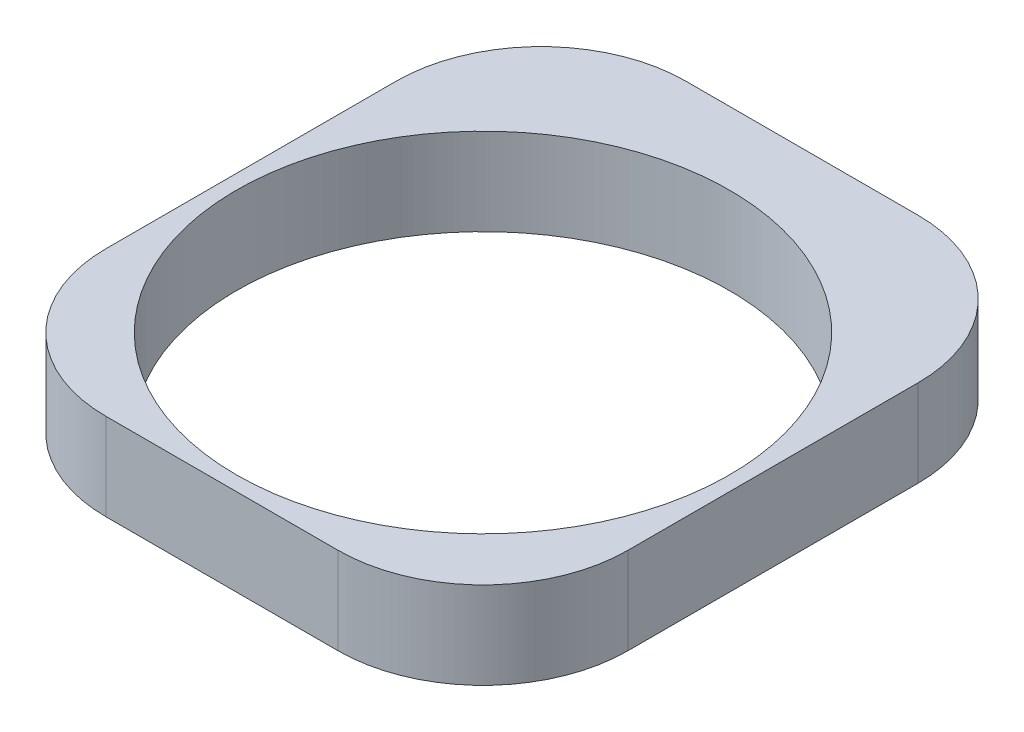
ISO-10303-21;
HEADER;
FILE_DESCRIPTION(('STEP AP214'),'2;1');
FILE_NAME('part.step','',(''),(''),'','','');
FILE_SCHEMA(('AUTOMOTIVE_DESIGN { 1 0 10303 214 1 1 1 1 }'));
ENDSEC;
DATA;
#1=APPLICATION_CONTEXT('core data for automotive mechanical design processes');
#2=APPLICATION_PROTOCOL_DEFINITION('international standard','automotive_design',2000,#1);
#3=PRODUCT_CONTEXT('',#1,'mechanical');
#4=PRODUCT('Part','Part','',(#3));
#5=PRODUCT_RELATED_PRODUCT_CATEGORY('part','',(#4));
#6=PRODUCT_DEFINITION_FORMATION('','',#4);
#7=PRODUCT_DEFINITION_CONTEXT('part definition',#1,'design');
#8=PRODUCT_DEFINITION('design','',#6,#7);
#9=PRODUCT_DEFINITION_SHAPE('','',#8);
#10=(LENGTH_UNIT() NAMED_UNIT(*) SI_UNIT(.MILLI.,.METRE.));
#11=(NAMED_UNIT(*) PLANE_ANGLE_UNIT() SI_UNIT($,.RADIAN.));
#12=(NAMED_UNIT(*) SI_UNIT($,.STERADIAN.) SOLID_ANGLE_UNIT());
#13=UNCERTAINTY_MEASURE_WITH_UNIT(LENGTH_MEASURE(1.E-05),#10,'distance_accuracy_value','');
#14=(GEOMETRIC_REPRESENTATION_CONTEXT(3) GLOBAL_UNCERTAINTY_ASSIGNED_CONTEXT((#13)) GLOBAL_UNIT_ASSIGNED_CONTEXT((#10,
#11,#12)) REPRESENTATION_CONTEXT('',''));
#15=CARTESIAN_POINT('',(0.,0.,0.));
#16=DIRECTION('',(0.,0.,1.));
#17=DIRECTION('',(1.,0.,0.));
#18=AXIS2_PLACEMENT_3D('',#15,#16,#17);
#19=CARTESIAN_POINT('',(0.,30.,0.));
#20=DIRECTION('',(-1.,0.,0.));
#21=DIRECTION('',(0.,0.,1.));
#22=AXIS2_PLACEMENT_3D('',#19,#20,#21);
#23=PLANE('',#22);
#24=DIRECTION('',(0.,0.,-1.));
#25=VECTOR('',#24,1.);
#26=CARTESIAN_POINT('',(0.,30.,0.));
#27=LINE('',#26,#25);
#28=CARTESIAN_POINT('',(0.,30.,-50.));
#29=VERTEX_POINT('',#28);
#30=CARTESIAN_POINT('',(0.,30.,-150.));
#31=VERTEX_POINT('',#30);
#32=EDGE_CURVE('E123',#29,#31,#27,.T.);
#33=ORIENTED_EDGE('',*,*,#32,.F.);
#34=DIRECTION('',(0.,-1.,0.));
#35=VECTOR('',#34,1.);
#36=CARTESIAN_POINT('',(0.,30.,-50.));
#37=LINE('',#36,#35);
#38=CARTESIAN_POINT('',(0.,0.,-50.));
#39=VERTEX_POINT('',#38);
#40=EDGE_CURVE('E130',#29,#39,#37,.T.);
#41=ORIENTED_EDGE('',*,*,#40,.T.);
#42=DIRECTION('',(0.,0.,-1.));
#43=VECTOR('',#42,1.);
#44=CARTESIAN_POINT('',(0.,0.,0.));
#45=LINE('',#44,#43);
#46=CARTESIAN_POINT('',(0.,0.,-150.));
#47=VERTEX_POINT('',#46);
#48=EDGE_CURVE('E114',#39,#47,#45,.T.);
#49=ORIENTED_EDGE('',*,*,#48,.T.);
#50=DIRECTION('',(0.,-1.,0.));
#51=VECTOR('',#50,1.);
#52=CARTESIAN_POINT('',(0.,30.,-150.));
#53=LINE('',#52,#51);
#54=EDGE_CURVE('E104',#47,#31,#53,.F.);
#55=ORIENTED_EDGE('',*,*,#54,.T.);
#56=EDGE_LOOP('',(#33,#41,#49,#55));
#57=FACE_BOUND('',#56,.T.);
#58=ADVANCED_FACE('F32',(#57),#23,.F.);
#59=CARTESIAN_POINT('',(0.,30.,-200.));
#60=DIRECTION('',(0.,0.,1.));
#61=DIRECTION('',(1.,0.,0.));
#62=AXIS2_PLACEMENT_3D('',#59,#60,#61);
#63=PLANE('',#62);
#64=DIRECTION('',(-1.,0.,0.));
#65=VECTOR('',#64,1.);
#66=CARTESIAN_POINT('',(0.,0.,-200.));
#67=LINE('',#66,#65);
#68=CARTESIAN_POINT('',(-50.,0.,-200.));
#69=VERTEX_POINT('',#68);
#70=CARTESIAN_POINT('',(-130.,0.,-200.));
#71=VERTEX_POINT('',#70);
#72=EDGE_CURVE('E108',#69,#71,#67,.T.);
#73=ORIENTED_EDGE('',*,*,#72,.T.);
#74=DIRECTION('',(0.,-1.,0.));
#75=VECTOR('',#74,1.);
#76=CARTESIAN_POINT('',(-130.,30.,-200.));
#77=LINE('',#76,#75);
#78=CARTESIAN_POINT('',(-130.,30.,-200.));
#79=VERTEX_POINT('',#78);
#80=EDGE_CURVE('E40',#71,#79,#77,.F.);
#81=ORIENTED_EDGE('',*,*,#80,.T.);
#82=DIRECTION('',(-1.,0.,0.));
#83=VECTOR('',#82,1.);
#84=CARTESIAN_POINT('',(0.,30.,-200.));
#85=LINE('',#84,#83);
#86=CARTESIAN_POINT('',(-50.,30.,-200.));
#87=VERTEX_POINT('',#86);
#88=EDGE_CURVE('E109',#87,#79,#85,.T.);
#89=ORIENTED_EDGE('',*,*,#88,.F.);
#90=DIRECTION('',(0.,-1.,0.));
#91=VECTOR('',#90,1.);
#92=CARTESIAN_POINT('',(-50.,30.,-200.));
#93=LINE('',#92,#91);
#94=EDGE_CURVE('E102',#87,#69,#93,.T.);
#95=ORIENTED_EDGE('',*,*,#94,.T.);
#96=EDGE_LOOP('',(#73,#81,#89,#95));
#97=FACE_BOUND('',#96,.T.);
#98=ADVANCED_FACE('F107',(#97),#63,.F.);
#99=CARTESIAN_POINT('',(-180.,30.,0.));
#100=DIRECTION('',(1.,0.,0.));
#101=DIRECTION('',(0.,0.,-1.));
#102=AXIS2_PLACEMENT_3D('',#99,#100,#101);
#103=PLANE('',#102);
#104=DIRECTION('',(0.,0.,1.));
#105=VECTOR('',#104,1.);
#106=CARTESIAN_POINT('',(-180.,30.,0.));
#107=LINE('',#106,#105);
#108=CARTESIAN_POINT('',(-180.,30.,-150.));
#109=VERTEX_POINT('',#108);
#110=CARTESIAN_POINT('',(-180.,30.,-50.));
#111=VERTEX_POINT('',#110);
#112=EDGE_CURVE('E159',#109,#111,#107,.T.);
#113=ORIENTED_EDGE('',*,*,#112,.F.);
#114=DIRECTION('',(0.,-1.,0.));
#115=VECTOR('',#114,1.);
#116=CARTESIAN_POINT('',(-180.,30.,-150.));
#117=LINE('',#116,#115);
#118=CARTESIAN_POINT('',(-180.,0.,-150.));
#119=VERTEX_POINT('',#118);
#120=EDGE_CURVE('E152',#109,#119,#117,.T.);
#121=ORIENTED_EDGE('',*,*,#120,.T.);
#122=DIRECTION('',(0.,0.,1.));
#123=VECTOR('',#122,1.);
#124=CARTESIAN_POINT('',(-180.,0.,0.));
#125=LINE('',#124,#123);
#126=CARTESIAN_POINT('',(-180.,0.,-50.));
#127=VERTEX_POINT('',#126);
#128=EDGE_CURVE('E113',#119,#127,#125,.T.);
#129=ORIENTED_EDGE('',*,*,#128,.T.);
#130=DIRECTION('',(0.,-1.,0.));
#131=VECTOR('',#130,1.);
#132=CARTESIAN_POINT('',(-180.,30.,-50.));
#133=LINE('',#132,#131);
#134=EDGE_CURVE('E147',#127,#111,#133,.F.);
#135=ORIENTED_EDGE('',*,*,#134,.T.);
#136=EDGE_LOOP('',(#113,#121,#129,#135));
#137=FACE_BOUND('',#136,.T.);
#138=ADVANCED_FACE('F158',(#137),#103,.F.);
#139=CARTESIAN_POINT('',(0.,30.,0.));
#140=DIRECTION('',(0.,0.,-1.));
#141=DIRECTION('',(-1.,0.,0.));
#142=AXIS2_PLACEMENT_3D('',#139,#140,#141);
#143=PLANE('',#142);
#144=DIRECTION('',(1.,0.,0.));
#145=VECTOR('',#144,1.);
#146=CARTESIAN_POINT('',(0.,30.,0.));
#147=LINE('',#146,#145);
#148=CARTESIAN_POINT('',(-130.,30.,0.));
#149=VERTEX_POINT('',#148);
#150=CARTESIAN_POINT('',(-50.,30.,0.));
#151=VERTEX_POINT('',#150);
#152=EDGE_CURVE('E110',#149,#151,#147,.T.);
#153=ORIENTED_EDGE('',*,*,#152,.F.);
#154=DIRECTION('',(0.,-1.,0.));
#155=VECTOR('',#154,1.);
#156=CARTESIAN_POINT('',(-130.,30.,0.));
#157=LINE('',#156,#155);
#158=CARTESIAN_POINT('',(-130.,0.,0.));
#159=VERTEX_POINT('',#158);
#160=EDGE_CURVE('E141',#149,#159,#157,.T.);
#161=ORIENTED_EDGE('',*,*,#160,.T.);
#162=DIRECTION('',(1.,0.,0.));
#163=VECTOR('',#162,1.);
#164=CARTESIAN_POINT('',(0.,0.,0.));
#165=LINE('',#164,#163);
#166=CARTESIAN_POINT('',(-50.,0.,0.));
#167=VERTEX_POINT('',#166);
#168=EDGE_CURVE('E116',#159,#167,#165,.T.);
#169=ORIENTED_EDGE('',*,*,#168,.T.);
#170=DIRECTION('',(0.,-1.,0.));
#171=VECTOR('',#170,1.);
#172=CARTESIAN_POINT('',(-50.,30.,0.));
#173=LINE('',#172,#171);
#174=EDGE_CURVE('E136',#167,#151,#173,.F.);
#175=ORIENTED_EDGE('',*,*,#174,.T.);
#176=EDGE_LOOP('',(#153,#161,#169,#175));
#177=FACE_BOUND('',#176,.T.);
#178=ADVANCED_FACE('F172',(#177),#143,.F.);
#179=CARTESIAN_POINT('',(0.,30.,0.));
#180=DIRECTION('',(0.,1.,0.));
#181=DIRECTION('',(0.,0.,1.));
#182=AXIS2_PLACEMENT_3D('',#179,#180,#181);
#183=PLANE('',#182);
#184=CARTESIAN_POINT('',(-90.,30.,-90.));
#185=DIRECTION('',(0.,1.,0.));
#186=DIRECTION('',(0.,0.,1.));
#187=AXIS2_PLACEMENT_3D('',#184,#185,#186);
#188=CIRCLE('',#187,85.);
#189=CARTESIAN_POINT('',(-90.,30.,-4.99999999999992));
#190=VERTEX_POINT('',#189);
#191=EDGE_CURVE('E125',#190,#190,#188,.T.);
#192=ORIENTED_EDGE('',*,*,#191,.F.);
#193=EDGE_LOOP('',(#192));
#194=FACE_BOUND('',#193,.T.);
#195=ORIENTED_EDGE('',*,*,#88,.T.);
#196=CARTESIAN_POINT('',(-130.,30.,-150.));
#197=DIRECTION('',(0.,1.,0.));
#198=DIRECTION('',(0.,0.,1.));
#199=AXIS2_PLACEMENT_3D('',#196,#197,#198);
#200=CIRCLE('',#199,50.);
#201=EDGE_CURVE('E11',#79,#109,#200,.T.);
#202=ORIENTED_EDGE('',*,*,#201,.T.);
#203=ORIENTED_EDGE('',*,*,#112,.T.);
#204=CARTESIAN_POINT('',(-130.,30.,-50.));
#205=DIRECTION('',(0.,1.,0.));
#206=DIRECTION('',(0.,0.,1.));
#207=AXIS2_PLACEMENT_3D('',#204,#205,#206);
#208=CIRCLE('',#207,50.);
#209=EDGE_CURVE('E150',#111,#149,#208,.T.);
#210=ORIENTED_EDGE('',*,*,#209,.T.);
#211=ORIENTED_EDGE('',*,*,#152,.T.);
#212=CARTESIAN_POINT('',(-50.,30.,-50.));
#213=DIRECTION('',(0.,1.,0.));
#214=DIRECTION('',(0.,0.,1.));
#215=AXIS2_PLACEMENT_3D('',#212,#213,#214);
#216=CIRCLE('',#215,50.);
#217=EDGE_CURVE('E139',#151,#29,#216,.T.);
#218=ORIENTED_EDGE('',*,*,#217,.T.);
#219=ORIENTED_EDGE('',*,*,#32,.T.);
#220=CARTESIAN_POINT('',(-50.,30.,-150.));
#221=DIRECTION('',(0.,1.,0.));
#222=DIRECTION('',(0.,0.,1.));
#223=AXIS2_PLACEMENT_3D('',#220,#221,#222);
#224=CIRCLE('',#223,50.);
#225=EDGE_CURVE('E128',#31,#87,#224,.T.);
#226=ORIENTED_EDGE('',*,*,#225,.T.);
#227=EDGE_LOOP('',(#195,#202,#203,#210,#211,#218,#219,#226));
#228=FACE_BOUND('',#227,.T.);
#229=ADVANCED_FACE('F170',(#194,#228),#183,.T.);
#230=CARTESIAN_POINT('',(0.,0.,0.));
#231=DIRECTION('',(0.,1.,0.));
#232=DIRECTION('',(0.,0.,1.));
#233=AXIS2_PLACEMENT_3D('',#230,#231,#232);
#234=PLANE('',#233);
#235=CARTESIAN_POINT('',(-90.,0.,-90.));
#236=DIRECTION('',(0.,1.,0.));
#237=DIRECTION('',(0.,0.,1.));
#238=AXIS2_PLACEMENT_3D('',#235,#236,#237);
#239=CIRCLE('',#238,85.);
#240=CARTESIAN_POINT('',(-90.,0.,-4.99999999999992));
#241=VERTEX_POINT('',#240);
#242=EDGE_CURVE('E118',#241,#241,#239,.T.);
#243=ORIENTED_EDGE('',*,*,#242,.T.);
#244=EDGE_LOOP('',(#243));
#245=FACE_BOUND('',#244,.T.);
#246=ORIENTED_EDGE('',*,*,#128,.F.);
#247=CARTESIAN_POINT('',(-130.,0.,-150.));
#248=DIRECTION('',(0.,1.,0.));
#249=DIRECTION('',(0.,0.,1.));
#250=AXIS2_PLACEMENT_3D('',#247,#248,#249);
#251=CIRCLE('',#250,50.);
#252=EDGE_CURVE('E54',#119,#71,#251,.F.);
#253=ORIENTED_EDGE('',*,*,#252,.T.);
#254=ORIENTED_EDGE('',*,*,#72,.F.);
#255=CARTESIAN_POINT('',(-50.,0.,-150.));
#256=DIRECTION('',(0.,1.,0.));
#257=DIRECTION('',(0.,0.,1.));
#258=AXIS2_PLACEMENT_3D('',#255,#256,#257);
#259=CIRCLE('',#258,50.);
#260=EDGE_CURVE('E98',#69,#47,#259,.F.);
#261=ORIENTED_EDGE('',*,*,#260,.T.);
#262=ORIENTED_EDGE('',*,*,#48,.F.);
#263=CARTESIAN_POINT('',(-50.,0.,-50.));
#264=DIRECTION('',(0.,1.,0.));
#265=DIRECTION('',(0.,0.,1.));
#266=AXIS2_PLACEMENT_3D('',#263,#264,#265);
#267=CIRCLE('',#266,50.);
#268=EDGE_CURVE('E133',#39,#167,#267,.F.);
#269=ORIENTED_EDGE('',*,*,#268,.T.);
#270=ORIENTED_EDGE('',*,*,#168,.F.);
#271=CARTESIAN_POINT('',(-130.,0.,-50.));
#272=DIRECTION('',(0.,1.,0.));
#273=DIRECTION('',(0.,0.,1.));
#274=AXIS2_PLACEMENT_3D('',#271,#272,#273);
#275=CIRCLE('',#274,50.);
#276=EDGE_CURVE('E144',#159,#127,#275,.F.);
#277=ORIENTED_EDGE('',*,*,#276,.T.);
#278=EDGE_LOOP('',(#246,#253,#254,#261,#262,#269,#270,#277));
#279=FACE_BOUND('',#278,.T.);
#280=ADVANCED_FACE('F112',(#245,#279),#234,.F.);
#281=CARTESIAN_POINT('',(-90.,-10.,-90.));
#282=DIRECTION('',(0.,1.,0.));
#283=DIRECTION('',(0.,0.,1.));
#284=AXIS2_PLACEMENT_3D('',#281,#282,#283);
#285=CYLINDRICAL_SURFACE('',#284,85.);
#286=ORIENTED_EDGE('',*,*,#191,.T.);
#287=EDGE_LOOP('',(#286));
#288=FACE_BOUND('',#287,.T.);
#289=ORIENTED_EDGE('',*,*,#242,.F.);
#290=EDGE_LOOP('',(#289));
#291=FACE_BOUND('',#290,.T.);
#292=ADVANCED_FACE('F182',(#288,#291),#285,.F.);
#293=CARTESIAN_POINT('',(-50.,30.,-150.));
#294=DIRECTION('',(0.,-1.,0.));
#295=DIRECTION('',(0.,0.,-1.));
#296=AXIS2_PLACEMENT_3D('',#293,#294,#295);
#297=CYLINDRICAL_SURFACE('',#296,50.);
#298=ORIENTED_EDGE('',*,*,#225,.F.);
#299=ORIENTED_EDGE('',*,*,#54,.F.);
#300=ORIENTED_EDGE('',*,*,#260,.F.);
#301=ORIENTED_EDGE('',*,*,#94,.F.);
#302=EDGE_LOOP('',(#298,#299,#300,#301));
#303=FACE_BOUND('',#302,.T.);
#304=ADVANCED_FACE('F101',(#303),#297,.T.);
#305=CARTESIAN_POINT('',(-50.,30.,-50.));
#306=DIRECTION('',(0.,-1.,0.));
#307=DIRECTION('',(0.,0.,-1.));
#308=AXIS2_PLACEMENT_3D('',#305,#306,#307);
#309=CYLINDRICAL_SURFACE('',#308,50.);
#310=ORIENTED_EDGE('',*,*,#217,.F.);
#311=ORIENTED_EDGE('',*,*,#174,.F.);
#312=ORIENTED_EDGE('',*,*,#268,.F.);
#313=ORIENTED_EDGE('',*,*,#40,.F.);
#314=EDGE_LOOP('',(#310,#311,#312,#313));
#315=FACE_BOUND('',#314,.T.);
#316=ADVANCED_FACE('F207',(#315),#309,.T.);
#317=CARTESIAN_POINT('',(-130.,30.,-50.));
#318=DIRECTION('',(0.,-1.,0.));
#319=DIRECTION('',(0.,0.,-1.));
#320=AXIS2_PLACEMENT_3D('',#317,#318,#319);
#321=CYLINDRICAL_SURFACE('',#320,50.);
#322=ORIENTED_EDGE('',*,*,#209,.F.);
#323=ORIENTED_EDGE('',*,*,#134,.F.);
#324=ORIENTED_EDGE('',*,*,#276,.F.);
#325=ORIENTED_EDGE('',*,*,#160,.F.);
#326=EDGE_LOOP('',(#322,#323,#324,#325));
#327=FACE_BOUND('',#326,.T.);
#328=ADVANCED_FACE('F167',(#327),#321,.T.);
#329=CARTESIAN_POINT('',(-130.,30.,-150.));
#330=DIRECTION('',(0.,-1.,0.));
#331=DIRECTION('',(0.,0.,-1.));
#332=AXIS2_PLACEMENT_3D('',#329,#330,#331);
#333=CYLINDRICAL_SURFACE('',#332,50.);
#334=ORIENTED_EDGE('',*,*,#201,.F.);
#335=ORIENTED_EDGE('',*,*,#80,.F.);
#336=ORIENTED_EDGE('',*,*,#252,.F.);
#337=ORIENTED_EDGE('',*,*,#120,.F.);
#338=EDGE_LOOP('',(#334,#335,#336,#337));
#339=FACE_BOUND('',#338,.T.);
#340=ADVANCED_FACE('F34',(#339),#333,.T.);
#341=CLOSED_SHELL('',(#58,#98,#138,#178,#229,#280,#292,#304,#316,#328,#340));
#342=MANIFOLD_SOLID_BREP('B2',#341);
#343=ADVANCED_BREP_SHAPE_REPRESENTATION('',(#18,#342),#14);
#344=SHAPE_DEFINITION_REPRESENTATION(#9,#343);
ENDSEC;
END-ISO-10303-21;
